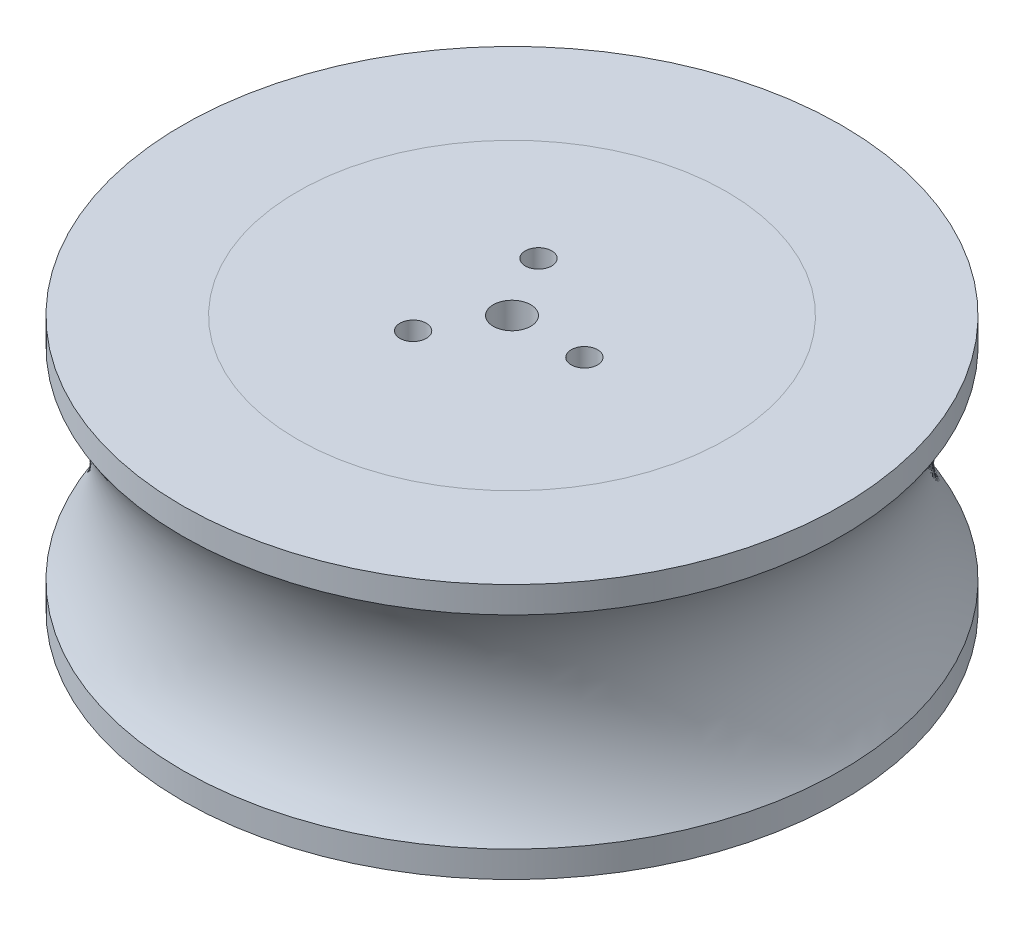
ISO-10303-21;
HEADER;
FILE_DESCRIPTION(('STEP AP214'),'2;1');
FILE_NAME('part.step','',(''),(''),'','','');
FILE_SCHEMA(('AUTOMOTIVE_DESIGN { 1 0 10303 214 1 1 1 1 }'));
ENDSEC;
DATA;
#1=APPLICATION_CONTEXT('core data for automotive mechanical design processes');
#2=APPLICATION_PROTOCOL_DEFINITION('international standard','automotive_design',2000,#1);
#3=PRODUCT_CONTEXT('',#1,'mechanical');
#4=PRODUCT('Part','Part','',(#3));
#5=PRODUCT_RELATED_PRODUCT_CATEGORY('part','',(#4));
#6=PRODUCT_DEFINITION_FORMATION('','',#4);
#7=PRODUCT_DEFINITION_CONTEXT('part definition',#1,'design');
#8=PRODUCT_DEFINITION('design','',#6,#7);
#9=PRODUCT_DEFINITION_SHAPE('','',#8);
#10=(LENGTH_UNIT() NAMED_UNIT(*) SI_UNIT(.MILLI.,.METRE.));
#11=(NAMED_UNIT(*) PLANE_ANGLE_UNIT() SI_UNIT($,.RADIAN.));
#12=(NAMED_UNIT(*) SI_UNIT($,.STERADIAN.) SOLID_ANGLE_UNIT());
#13=UNCERTAINTY_MEASURE_WITH_UNIT(LENGTH_MEASURE(1.E-05),#10,'distance_accuracy_value','');
#14=(GEOMETRIC_REPRESENTATION_CONTEXT(3) GLOBAL_UNCERTAINTY_ASSIGNED_CONTEXT((#13)) GLOBAL_UNIT_ASSIGNED_CONTEXT((#10,
#11,#12)) REPRESENTATION_CONTEXT('',''));
#15=CARTESIAN_POINT('',(0.,0.,0.));
#16=DIRECTION('',(0.,0.,1.));
#17=DIRECTION('',(1.,0.,0.));
#18=AXIS2_PLACEMENT_3D('',#15,#16,#17);
#19=CARTESIAN_POINT('',(4.66871083855486,14.3157275999567,50.4));
#20=DIRECTION('',(0.,1.,0.));
#21=DIRECTION('',(0.,0.,1.));
#22=AXIS2_PLACEMENT_3D('',#19,#20,#21);
#23=CYLINDRICAL_SURFACE('',#22,38.7000000000001);
#24=CARTESIAN_POINT('',(4.66871083855486,11.2199285391214,50.4));
#25=DIRECTION('',(0.,1.,0.));
#26=DIRECTION('',(0.,0.,1.));
#27=AXIS2_PLACEMENT_3D('',#24,#25,#26);
#28=CIRCLE('',#27,38.7000000000003);
#29=CARTESIAN_POINT('',(4.66871083855486,11.2199285391214,89.1000000000003));
#30=VERTEX_POINT('',#29);
#31=EDGE_CURVE('P0_E37',#30,#30,#28,.T.);
#32=ORIENTED_EDGE('',*,*,#31,.T.);
#33=EDGE_LOOP('',(#32));
#34=FACE_BOUND('',#33,.T.);
#35=CARTESIAN_POINT('',(4.66871083855486,14.3157275999567,50.4));
#36=DIRECTION('',(0.,1.,0.));
#37=DIRECTION('',(0.,0.,1.));
#38=AXIS2_PLACEMENT_3D('',#35,#36,#37);
#39=CIRCLE('',#38,38.7000000000001);
#40=CARTESIAN_POINT('',(4.66871083855486,14.3157275999567,89.1000000000001));
#41=VERTEX_POINT('',#40);
#42=EDGE_CURVE('P0_E25',#41,#41,#39,.T.);
#43=ORIENTED_EDGE('',*,*,#42,.F.);
#44=EDGE_LOOP('',(#43));
#45=FACE_BOUND('',#44,.T.);
#46=ADVANCED_FACE('P0_F22',(#34,#45),#23,.T.);
#47=CARTESIAN_POINT('',(4.66871083855486,14.3157275999567,75.6));
#48=DIRECTION('',(0.,1.,0.));
#49=DIRECTION('',(0.,0.,1.));
#50=AXIS2_PLACEMENT_3D('',#47,#48,#49);
#51=PLANE('',#50);
#52=CARTESIAN_POINT('',(4.66871083855486,14.3157275999567,50.4));
#53=DIRECTION('',(0.,1.,0.));
#54=DIRECTION('',(0.,0.,1.));
#55=AXIS2_PLACEMENT_3D('',#52,#53,#54);
#56=CIRCLE('',#55,25.2);
#57=CARTESIAN_POINT('',(4.66871083855486,14.3157275999567,75.6));
#58=VERTEX_POINT('',#57);
#59=EDGE_CURVE('P0_E39',#58,#58,#56,.F.);
#60=ORIENTED_EDGE('',*,*,#59,.T.);
#61=EDGE_LOOP('',(#60));
#62=FACE_BOUND('',#61,.T.);
#63=ORIENTED_EDGE('',*,*,#42,.T.);
#64=EDGE_LOOP('',(#63));
#65=FACE_BOUND('',#64,.T.);
#66=ADVANCED_FACE('P0_F56',(#62,#65),#51,.T.);
#67=CARTESIAN_POINT('',(4.66871083855486,-0.684272400043262,50.4));
#68=DIRECTION('',(0.,1.,0.));
#69=DIRECTION('',(0.,0.,1.));
#70=AXIS2_PLACEMENT_3D('',#67,#68,#69);
#71=TOROIDAL_SURFACE('',#70,55.9999999999999,20.9999999999999);
#72=ORIENTED_EDGE('',*,*,#31,.F.);
#73=EDGE_LOOP('',(#72));
#74=FACE_BOUND('',#73,.T.);
#75=CARTESIAN_POINT('',(4.66871083855486,-12.588473339208,50.4));
#76=DIRECTION('',(0.,1.,0.));
#77=DIRECTION('',(0.,0.,1.));
#78=AXIS2_PLACEMENT_3D('',#75,#76,#77);
#79=CIRCLE('',#78,38.7000000000001);
#80=CARTESIAN_POINT('',(4.66871083855486,-12.588473339208,89.1000000000001));
#81=VERTEX_POINT('',#80);
#82=EDGE_CURVE('P0_E34',#81,#81,#79,.F.);
#83=ORIENTED_EDGE('',*,*,#82,.F.);
#84=EDGE_LOOP('',(#83));
#85=FACE_BOUND('',#84,.T.);
#86=ADVANCED_FACE('P0_F52',(#74,#85),#71,.F.);
#87=CARTESIAN_POINT('',(4.66871083855486,14.3157275999567,50.4));
#88=DIRECTION('',(0.,1.,0.));
#89=DIRECTION('',(0.,0.,1.));
#90=AXIS2_PLACEMENT_3D('',#87,#88,#89);
#91=CYLINDRICAL_SURFACE('',#90,25.2);
#92=ORIENTED_EDGE('',*,*,#59,.F.);
#93=EDGE_LOOP('',(#92));
#94=FACE_BOUND('',#93,.T.);
#95=CARTESIAN_POINT('',(4.66871083855486,-15.6842724000433,50.4));
#96=DIRECTION('',(0.,1.,0.));
#97=DIRECTION('',(0.,0.,1.));
#98=AXIS2_PLACEMENT_3D('',#95,#96,#97);
#99=CIRCLE('',#98,25.2);
#100=CARTESIAN_POINT('',(4.66871083855486,-15.6842724000433,75.6));
#101=VERTEX_POINT('',#100);
#102=EDGE_CURVE('P0_E29',#101,#101,#99,.T.);
#103=ORIENTED_EDGE('',*,*,#102,.F.);
#104=EDGE_LOOP('',(#103));
#105=FACE_BOUND('',#104,.T.);
#106=ADVANCED_FACE('P0_F55',(#94,#105),#91,.F.);
#107=CARTESIAN_POINT('',(4.66871083855486,14.3157275999567,50.4));
#108=DIRECTION('',(0.,1.,0.));
#109=DIRECTION('',(0.,0.,1.));
#110=AXIS2_PLACEMENT_3D('',#107,#108,#109);
#111=CYLINDRICAL_SURFACE('',#110,38.7000000000001);
#112=CARTESIAN_POINT('',(4.66871083855486,-15.6842724000433,50.4));
#113=DIRECTION('',(0.,1.,0.));
#114=DIRECTION('',(0.,0.,1.));
#115=AXIS2_PLACEMENT_3D('',#112,#113,#114);
#116=CIRCLE('',#115,38.7000000000001);
#117=CARTESIAN_POINT('',(4.66871083855486,-15.6842724000433,89.1000000000001));
#118=VERTEX_POINT('',#117);
#119=EDGE_CURVE('P0_E12',#118,#118,#116,.F.);
#120=ORIENTED_EDGE('',*,*,#119,.F.);
#121=EDGE_LOOP('',(#120));
#122=FACE_BOUND('',#121,.T.);
#123=ORIENTED_EDGE('',*,*,#82,.T.);
#124=EDGE_LOOP('',(#123));
#125=FACE_BOUND('',#124,.T.);
#126=ADVANCED_FACE('P0_F60',(#122,#125),#111,.T.);
#127=CARTESIAN_POINT('',(4.66871083855486,-15.6842724000433,75.6));
#128=DIRECTION('',(0.,-1.,0.));
#129=DIRECTION('',(0.,0.,-1.));
#130=AXIS2_PLACEMENT_3D('',#127,#128,#129);
#131=PLANE('',#130);
#132=ORIENTED_EDGE('',*,*,#119,.T.);
#133=EDGE_LOOP('',(#132));
#134=FACE_BOUND('',#133,.T.);
#135=ORIENTED_EDGE('',*,*,#102,.T.);
#136=EDGE_LOOP('',(#135));
#137=FACE_BOUND('',#136,.T.);
#138=ADVANCED_FACE('P0_F62',(#134,#137),#131,.T.);
#139=CLOSED_SHELL('',(#46,#66,#86,#106,#126,#138));
#140=MANIFOLD_SOLID_BREP('P0_B1',#139);
#141=CARTESIAN_POINT('',(4.66871083855486,10.3157275999567,50.4));
#142=DIRECTION('',(0.,1.,0.));
#143=DIRECTION('',(0.,0.,1.));
#144=AXIS2_PLACEMENT_3D('',#141,#142,#143);
#145=PLANE('',#144);
#146=CARTESIAN_POINT('',(4.66871083855486,10.3157275999567,50.4));
#147=DIRECTION('',(0.,-1.,0.));
#148=DIRECTION('',(0.,0.,-1.));
#149=AXIS2_PLACEMENT_3D('',#146,#147,#148);
#150=CIRCLE('',#149,23.2);
#151=CARTESIAN_POINT('',(4.66871083855486,10.3157275999567,27.2));
#152=VERTEX_POINT('',#151);
#153=EDGE_CURVE('P1_E51',#152,#152,#150,.T.);
#154=ORIENTED_EDGE('',*,*,#153,.T.);
#155=EDGE_LOOP('',(#154));
#156=FACE_BOUND('',#155,.T.);
#157=CARTESIAN_POINT('',(4.66871083855486,10.3157275999567,50.4));
#158=DIRECTION('',(0.,1.,0.));
#159=DIRECTION('',(0.,0.,1.));
#160=AXIS2_PLACEMENT_3D('',#157,#158,#159);
#161=CIRCLE('',#160,2.2);
#162=CARTESIAN_POINT('',(4.66871083855486,10.3157275999567,52.6));
#163=VERTEX_POINT('',#162);
#164=EDGE_CURVE('P1_E54',#163,#163,#161,.T.);
#165=ORIENTED_EDGE('',*,*,#164,.T.);
#166=EDGE_LOOP('',(#165));
#167=FACE_BOUND('',#166,.T.);
#168=CARTESIAN_POINT('',(0.418710838554925,10.3157275999567,43.0387840678322));
#169=DIRECTION('',(0.,1.,0.));
#170=DIRECTION('',(0.,0.,1.));
#171=AXIS2_PLACEMENT_3D('',#168,#169,#170);
#172=CIRCLE('',#171,1.55);
#173=CARTESIAN_POINT('',(0.418710838554925,10.3157275999567,44.5887840678322));
#174=VERTEX_POINT('',#173);
#175=EDGE_CURVE('P1_E57',#174,#174,#172,.T.);
#176=ORIENTED_EDGE('',*,*,#175,.T.);
#177=EDGE_LOOP('',(#176));
#178=FACE_BOUND('',#177,.T.);
#179=CARTESIAN_POINT('',(0.418710838554822,10.3157275999567,57.7612159321677));
#180=DIRECTION('',(0.,1.,0.));
#181=DIRECTION('',(0.,0.,1.));
#182=AXIS2_PLACEMENT_3D('',#179,#180,#181);
#183=CIRCLE('',#182,1.55);
#184=CARTESIAN_POINT('',(0.418710838554822,10.3157275999567,59.3112159321677));
#185=VERTEX_POINT('',#184);
#186=EDGE_CURVE('P1_E59',#185,#185,#183,.T.);
#187=ORIENTED_EDGE('',*,*,#186,.T.);
#188=EDGE_LOOP('',(#187));
#189=FACE_BOUND('',#188,.T.);
#190=CARTESIAN_POINT('',(13.1687108385549,10.3157275999567,50.4));
#191=DIRECTION('',(0.,1.,0.));
#192=DIRECTION('',(0.,0.,1.));
#193=AXIS2_PLACEMENT_3D('',#190,#191,#192);
#194=CIRCLE('',#193,1.55);
#195=CARTESIAN_POINT('',(13.1687108385549,10.3157275999567,51.95));
#196=VERTEX_POINT('',#195);
#197=EDGE_CURVE('P1_E25',#196,#196,#194,.T.);
#198=ORIENTED_EDGE('',*,*,#197,.T.);
#199=EDGE_LOOP('',(#198));
#200=FACE_BOUND('',#199,.T.);
#201=ADVANCED_FACE('P1_F22',(#156,#167,#178,#189,#200),#145,.F.);
#202=CARTESIAN_POINT('',(13.1687108385549,10.3157275999567,50.4));
#203=DIRECTION('',(0.,1.,0.));
#204=DIRECTION('',(0.,0.,1.));
#205=AXIS2_PLACEMENT_3D('',#202,#203,#204);
#206=CYLINDRICAL_SURFACE('',#205,1.55);
#207=CARTESIAN_POINT('',(13.1687108385549,14.3157275999567,50.4));
#208=DIRECTION('',(0.,1.,0.));
#209=DIRECTION('',(0.,0.,1.));
#210=AXIS2_PLACEMENT_3D('',#207,#208,#209);
#211=CIRCLE('',#210,1.55);
#212=CARTESIAN_POINT('',(13.1687108385549,14.3157275999567,51.95));
#213=VERTEX_POINT('',#212);
#214=EDGE_CURVE('P1_E48',#213,#213,#211,.F.);
#215=ORIENTED_EDGE('',*,*,#214,.F.);
#216=EDGE_LOOP('',(#215));
#217=FACE_BOUND('',#216,.T.);
#218=ORIENTED_EDGE('',*,*,#197,.F.);
#219=EDGE_LOOP('',(#218));
#220=FACE_BOUND('',#219,.T.);
#221=ADVANCED_FACE('P1_F67',(#217,#220),#206,.F.);
#222=CARTESIAN_POINT('',(0.418710838554822,10.3157275999567,57.7612159321677));
#223=DIRECTION('',(0.,1.,0.));
#224=DIRECTION('',(0.,0.,1.));
#225=AXIS2_PLACEMENT_3D('',#222,#223,#224);
#226=CYLINDRICAL_SURFACE('',#225,1.55);
#227=CARTESIAN_POINT('',(0.418710838554822,14.3157275999567,57.7612159321677));
#228=DIRECTION('',(0.,1.,0.));
#229=DIRECTION('',(0.,0.,1.));
#230=AXIS2_PLACEMENT_3D('',#227,#228,#229);
#231=CIRCLE('',#230,1.55);
#232=CARTESIAN_POINT('',(0.418710838554822,14.3157275999567,59.3112159321677));
#233=VERTEX_POINT('',#232);
#234=EDGE_CURVE('P1_E45',#233,#233,#231,.F.);
#235=ORIENTED_EDGE('',*,*,#234,.F.);
#236=EDGE_LOOP('',(#235));
#237=FACE_BOUND('',#236,.T.);
#238=ORIENTED_EDGE('',*,*,#186,.F.);
#239=EDGE_LOOP('',(#238));
#240=FACE_BOUND('',#239,.T.);
#241=ADVANCED_FACE('P1_F69',(#237,#240),#226,.F.);
#242=CARTESIAN_POINT('',(0.418710838554925,10.3157275999567,43.0387840678322));
#243=DIRECTION('',(0.,1.,0.));
#244=DIRECTION('',(0.,0.,1.));
#245=AXIS2_PLACEMENT_3D('',#242,#243,#244);
#246=CYLINDRICAL_SURFACE('',#245,1.55);
#247=CARTESIAN_POINT('',(0.418710838554925,14.3157275999567,43.0387840678322));
#248=DIRECTION('',(0.,1.,0.));
#249=DIRECTION('',(0.,0.,1.));
#250=AXIS2_PLACEMENT_3D('',#247,#248,#249);
#251=CIRCLE('',#250,1.55);
#252=CARTESIAN_POINT('',(0.418710838554925,14.3157275999567,44.5887840678322));
#253=VERTEX_POINT('',#252);
#254=EDGE_CURVE('P1_E42',#253,#253,#251,.F.);
#255=ORIENTED_EDGE('',*,*,#254,.F.);
#256=EDGE_LOOP('',(#255));
#257=FACE_BOUND('',#256,.T.);
#258=ORIENTED_EDGE('',*,*,#175,.F.);
#259=EDGE_LOOP('',(#258));
#260=FACE_BOUND('',#259,.T.);
#261=ADVANCED_FACE('P1_F76',(#257,#260),#246,.F.);
#262=CARTESIAN_POINT('',(4.66871083855486,10.3157275999567,50.4));
#263=DIRECTION('',(0.,1.,0.));
#264=DIRECTION('',(0.,0.,1.));
#265=AXIS2_PLACEMENT_3D('',#262,#263,#264);
#266=CYLINDRICAL_SURFACE('',#265,2.2);
#267=CARTESIAN_POINT('',(4.66871083855486,14.3157275999567,50.4));
#268=DIRECTION('',(0.,1.,0.));
#269=DIRECTION('',(0.,0.,1.));
#270=AXIS2_PLACEMENT_3D('',#267,#268,#269);
#271=CIRCLE('',#270,2.2);
#272=CARTESIAN_POINT('',(4.66871083855486,14.3157275999567,52.6));
#273=VERTEX_POINT('',#272);
#274=EDGE_CURVE('P1_E39',#273,#273,#271,.F.);
#275=ORIENTED_EDGE('',*,*,#274,.F.);
#276=EDGE_LOOP('',(#275));
#277=FACE_BOUND('',#276,.T.);
#278=ORIENTED_EDGE('',*,*,#164,.F.);
#279=EDGE_LOOP('',(#278));
#280=FACE_BOUND('',#279,.T.);
#281=ADVANCED_FACE('P1_F99',(#277,#280),#266,.F.);
#282=CARTESIAN_POINT('',(4.66871083855486,14.3157275999567,50.4));
#283=DIRECTION('',(0.,-1.,0.));
#284=DIRECTION('',(0.,0.,-1.));
#285=AXIS2_PLACEMENT_3D('',#282,#283,#284);
#286=CYLINDRICAL_SURFACE('',#285,23.2);
#287=CARTESIAN_POINT('',(4.66871083855486,-15.6842724000433,50.4));
#288=DIRECTION('',(0.,-1.,0.));
#289=DIRECTION('',(0.,0.,-1.));
#290=AXIS2_PLACEMENT_3D('',#287,#288,#289);
#291=CIRCLE('',#290,23.2);
#292=CARTESIAN_POINT('',(4.66871083855486,-15.6842724000433,27.2));
#293=VERTEX_POINT('',#292);
#294=EDGE_CURVE('P1_E34',#293,#293,#291,.T.);
#295=ORIENTED_EDGE('',*,*,#294,.T.);
#296=EDGE_LOOP('',(#295));
#297=FACE_BOUND('',#296,.T.);
#298=ORIENTED_EDGE('',*,*,#153,.F.);
#299=EDGE_LOOP('',(#298));
#300=FACE_BOUND('',#299,.T.);
#301=ADVANCED_FACE('P1_F95',(#297,#300),#286,.F.);
#302=CARTESIAN_POINT('',(4.66871083855486,14.3157275999567,50.4));
#303=DIRECTION('',(0.,1.,0.));
#304=DIRECTION('',(0.,0.,1.));
#305=AXIS2_PLACEMENT_3D('',#302,#303,#304);
#306=PLANE('',#305);
#307=CARTESIAN_POINT('',(4.66871083855486,14.3157275999567,50.4));
#308=DIRECTION('',(0.,-1.,0.));
#309=DIRECTION('',(0.,0.,-1.));
#310=AXIS2_PLACEMENT_3D('',#307,#308,#309);
#311=CIRCLE('',#310,25.2);
#312=CARTESIAN_POINT('',(4.66871083855486,14.3157275999567,25.2));
#313=VERTEX_POINT('',#312);
#314=EDGE_CURVE('P1_E29',#313,#313,#311,.T.);
#315=ORIENTED_EDGE('',*,*,#314,.F.);
#316=EDGE_LOOP('',(#315));
#317=FACE_BOUND('',#316,.T.);
#318=ORIENTED_EDGE('',*,*,#274,.T.);
#319=EDGE_LOOP('',(#318));
#320=FACE_BOUND('',#319,.T.);
#321=ORIENTED_EDGE('',*,*,#254,.T.);
#322=EDGE_LOOP('',(#321));
#323=FACE_BOUND('',#322,.T.);
#324=ORIENTED_EDGE('',*,*,#234,.T.);
#325=EDGE_LOOP('',(#324));
#326=FACE_BOUND('',#325,.T.);
#327=ORIENTED_EDGE('',*,*,#214,.T.);
#328=EDGE_LOOP('',(#327));
#329=FACE_BOUND('',#328,.T.);
#330=ADVANCED_FACE('P1_F88',(#317,#320,#323,#326,#329),#306,.T.);
#331=CARTESIAN_POINT('',(4.66871083855486,-15.6842724000433,50.4));
#332=DIRECTION('',(0.,1.,0.));
#333=DIRECTION('',(0.,0.,1.));
#334=AXIS2_PLACEMENT_3D('',#331,#332,#333);
#335=PLANE('',#334);
#336=ORIENTED_EDGE('',*,*,#294,.F.);
#337=EDGE_LOOP('',(#336));
#338=FACE_BOUND('',#337,.T.);
#339=CARTESIAN_POINT('',(4.66871083855486,-15.6842724000433,50.4));
#340=DIRECTION('',(0.,-1.,0.));
#341=DIRECTION('',(0.,0.,-1.));
#342=AXIS2_PLACEMENT_3D('',#339,#340,#341);
#343=CIRCLE('',#342,25.2);
#344=CARTESIAN_POINT('',(4.66871083855486,-15.6842724000433,25.2));
#345=VERTEX_POINT('',#344);
#346=EDGE_CURVE('P1_E12',#345,#345,#343,.F.);
#347=ORIENTED_EDGE('',*,*,#346,.F.);
#348=EDGE_LOOP('',(#347));
#349=FACE_BOUND('',#348,.T.);
#350=ADVANCED_FACE('P1_F83',(#338,#349),#335,.F.);
#351=CARTESIAN_POINT('',(4.66871083855486,14.3157275999567,50.4));
#352=DIRECTION('',(0.,-1.,0.));
#353=DIRECTION('',(0.,0.,-1.));
#354=AXIS2_PLACEMENT_3D('',#351,#352,#353);
#355=CYLINDRICAL_SURFACE('',#354,25.2);
#356=ORIENTED_EDGE('',*,*,#346,.T.);
#357=EDGE_LOOP('',(#356));
#358=FACE_BOUND('',#357,.T.);
#359=ORIENTED_EDGE('',*,*,#314,.T.);
#360=EDGE_LOOP('',(#359));
#361=FACE_BOUND('',#360,.T.);
#362=ADVANCED_FACE('P1_F81',(#358,#361),#355,.T.);
#363=CLOSED_SHELL('',(#201,#221,#241,#261,#281,#301,#330,#350,#362));
#364=MANIFOLD_SOLID_BREP('P1_B1',#363);
#365=ADVANCED_BREP_SHAPE_REPRESENTATION('',(#18,#140,#364),#14);
#366=SHAPE_DEFINITION_REPRESENTATION(#9,#365);
ENDSEC;
END-ISO-10303-21;
